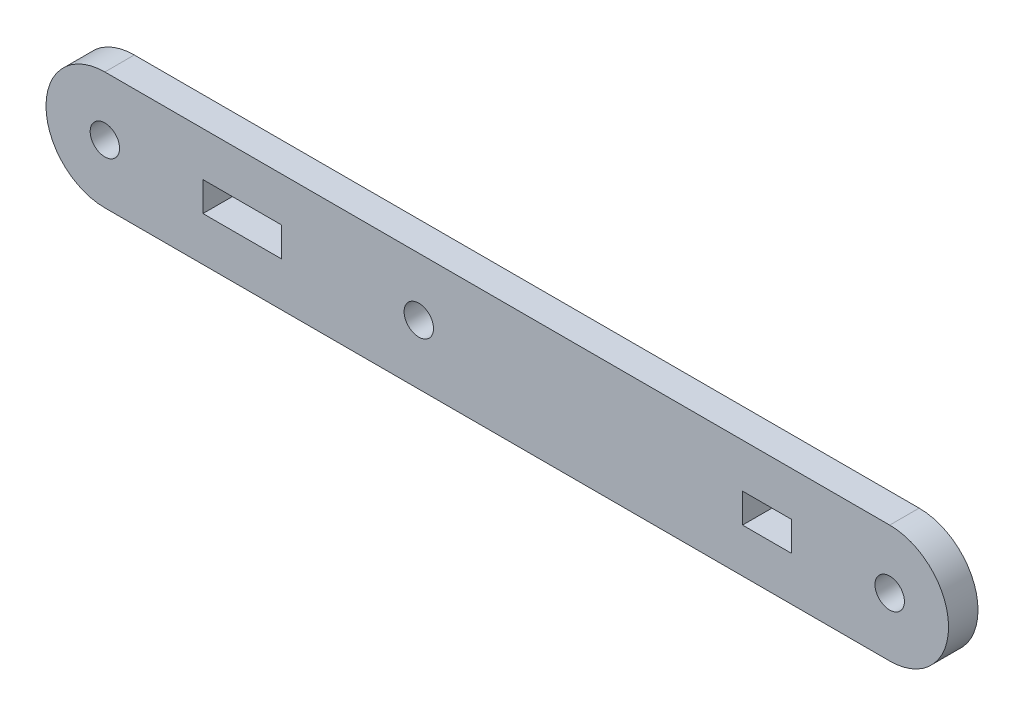
ISO-10303-21;
HEADER;
FILE_DESCRIPTION(('STEP AP214'),'2;1');
FILE_NAME('part.step','',(''),(''),'','','');
FILE_SCHEMA(('AUTOMOTIVE_DESIGN { 1 0 10303 214 1 1 1 1 }'));
ENDSEC;
DATA;
#1=APPLICATION_CONTEXT('core data for automotive mechanical design processes');
#2=APPLICATION_PROTOCOL_DEFINITION('international standard','automotive_design',2000,#1);
#3=PRODUCT_CONTEXT('',#1,'mechanical');
#4=PRODUCT('Part','Part','',(#3));
#5=PRODUCT_RELATED_PRODUCT_CATEGORY('part','',(#4));
#6=PRODUCT_DEFINITION_FORMATION('','',#4);
#7=PRODUCT_DEFINITION_CONTEXT('part definition',#1,'design');
#8=PRODUCT_DEFINITION('design','',#6,#7);
#9=PRODUCT_DEFINITION_SHAPE('','',#8);
#10=(LENGTH_UNIT() NAMED_UNIT(*) SI_UNIT(.MILLI.,.METRE.));
#11=(NAMED_UNIT(*) PLANE_ANGLE_UNIT() SI_UNIT($,.RADIAN.));
#12=(NAMED_UNIT(*) SI_UNIT($,.STERADIAN.) SOLID_ANGLE_UNIT());
#13=UNCERTAINTY_MEASURE_WITH_UNIT(LENGTH_MEASURE(1.E-05),#10,'distance_accuracy_value','');
#14=(GEOMETRIC_REPRESENTATION_CONTEXT(3) GLOBAL_UNCERTAINTY_ASSIGNED_CONTEXT((#13)) GLOBAL_UNIT_ASSIGNED_CONTEXT((#10,
#11,#12)) REPRESENTATION_CONTEXT('',''));
#15=CARTESIAN_POINT('',(0.,0.,0.));
#16=DIRECTION('',(0.,0.,1.));
#17=DIRECTION('',(1.,0.,0.));
#18=AXIS2_PLACEMENT_3D('',#15,#16,#17);
#19=CARTESIAN_POINT('',(-62.9738368541819,-40.5517486709935,3.));
#20=DIRECTION('',(0.,0.,1.));
#21=DIRECTION('',(1.,0.,0.));
#22=AXIS2_PLACEMENT_3D('',#19,#20,#21);
#23=PLANE('',#22);
#24=DIRECTION('',(1.,0.,0.));
#25=VECTOR('',#24,1.);
#26=CARTESIAN_POINT('',(-52.9738368541819,-42.0517486709935,3.));
#27=LINE('',#26,#25);
#28=CARTESIAN_POINT('',(-52.9738368541819,-42.0517486709935,3.));
#29=VERTEX_POINT('',#28);
#30=CARTESIAN_POINT('',(-44.9738368541819,-42.0517486709935,3.));
#31=VERTEX_POINT('',#30);
#32=EDGE_CURVE('E164',#29,#31,#27,.T.);
#33=ORIENTED_EDGE('',*,*,#32,.F.);
#34=DIRECTION('',(0.,-1.,0.));
#35=VECTOR('',#34,1.);
#36=CARTESIAN_POINT('',(-52.9738368541819,-42.0517486709935,3.));
#37=LINE('',#36,#35);
#38=CARTESIAN_POINT('',(-52.9738368541819,-39.0517486709935,3.));
#39=VERTEX_POINT('',#38);
#40=EDGE_CURVE('E162',#39,#29,#37,.T.);
#41=ORIENTED_EDGE('',*,*,#40,.F.);
#42=DIRECTION('',(-1.,0.,0.));
#43=VECTOR('',#42,1.);
#44=CARTESIAN_POINT('',(-52.9738368541819,-39.0517486709935,3.));
#45=LINE('',#44,#43);
#46=CARTESIAN_POINT('',(-44.9738368541819,-39.0517486709935,3.));
#47=VERTEX_POINT('',#46);
#48=EDGE_CURVE('E170',#47,#39,#45,.T.);
#49=ORIENTED_EDGE('',*,*,#48,.F.);
#50=DIRECTION('',(0.,1.,0.));
#51=VECTOR('',#50,1.);
#52=CARTESIAN_POINT('',(-44.9738368541819,-42.0517486709935,3.));
#53=LINE('',#52,#51);
#54=EDGE_CURVE('E167',#31,#47,#53,.T.);
#55=ORIENTED_EDGE('',*,*,#54,.F.);
#56=EDGE_LOOP('',(#33,#41,#49,#55));
#57=FACE_BOUND('',#56,.T.);
#58=CARTESIAN_POINT('',(-30.9738368541819,-40.4576031559384,3.));
#59=DIRECTION('',(0.,0.,1.));
#60=DIRECTION('',(1.,0.,0.));
#61=AXIS2_PLACEMENT_3D('',#58,#59,#60);
#62=CIRCLE('',#61,1.5);
#63=CARTESIAN_POINT('',(-29.4738368541819,-40.4576031559384,3.));
#64=VERTEX_POINT('',#63);
#65=EDGE_CURVE('E199',#64,#64,#62,.T.);
#66=ORIENTED_EDGE('',*,*,#65,.F.);
#67=EDGE_LOOP('',(#66));
#68=FACE_BOUND('',#67,.T.);
#69=CARTESIAN_POINT('',(-62.9738368541819,-40.5517486709935,3.));
#70=DIRECTION('',(0.,0.,1.));
#71=DIRECTION('',(1.,0.,0.));
#72=AXIS2_PLACEMENT_3D('',#69,#70,#71);
#73=CIRCLE('',#72,6.);
#74=CARTESIAN_POINT('',(-62.9738368541819,-34.5517486709935,3.));
#75=VERTEX_POINT('',#74);
#76=CARTESIAN_POINT('',(-62.9738368541819,-46.5517486709935,3.));
#77=VERTEX_POINT('',#76);
#78=EDGE_CURVE('E211',#75,#77,#73,.T.);
#79=ORIENTED_EDGE('',*,*,#78,.T.);
#80=DIRECTION('',(1.,0.,0.));
#81=VECTOR('',#80,1.);
#82=CARTESIAN_POINT('',(-62.9738368541819,-46.5517486709935,3.));
#83=LINE('',#82,#81);
#84=CARTESIAN_POINT('',(17.0261631458181,-46.5517486709935,3.));
#85=VERTEX_POINT('',#84);
#86=EDGE_CURVE('E214',#77,#85,#83,.T.);
#87=ORIENTED_EDGE('',*,*,#86,.T.);
#88=CARTESIAN_POINT('',(17.0261631458181,-40.5517486709935,3.));
#89=DIRECTION('',(0.,0.,1.));
#90=DIRECTION('',(1.,0.,0.));
#91=AXIS2_PLACEMENT_3D('',#88,#89,#90);
#92=CIRCLE('',#91,6.);
#93=CARTESIAN_POINT('',(17.0261631458181,-34.5517486709935,3.));
#94=VERTEX_POINT('',#93);
#95=EDGE_CURVE('E217',#85,#94,#92,.T.);
#96=ORIENTED_EDGE('',*,*,#95,.T.);
#97=DIRECTION('',(-1.,0.,0.));
#98=VECTOR('',#97,1.);
#99=CARTESIAN_POINT('',(-62.9738368541819,-34.5517486709935,3.));
#100=LINE('',#99,#98);
#101=EDGE_CURVE('E219',#94,#75,#100,.T.);
#102=ORIENTED_EDGE('',*,*,#101,.T.);
#103=EDGE_LOOP('',(#79,#87,#96,#102));
#104=FACE_BOUND('',#103,.T.);
#105=CARTESIAN_POINT('',(-62.9738368541819,-40.5517486709935,3.));
#106=DIRECTION('',(0.,0.,1.));
#107=DIRECTION('',(1.,0.,0.));
#108=AXIS2_PLACEMENT_3D('',#105,#106,#107);
#109=CIRCLE('',#108,1.5);
#110=CARTESIAN_POINT('',(-61.4738368541819,-40.5517486709935,3.));
#111=VERTEX_POINT('',#110);
#112=EDGE_CURVE('E205',#111,#111,#109,.T.);
#113=ORIENTED_EDGE('',*,*,#112,.F.);
#114=EDGE_LOOP('',(#113));
#115=FACE_BOUND('',#114,.T.);
#116=CARTESIAN_POINT('',(17.0261631458181,-40.5517486709935,3.));
#117=DIRECTION('',(0.,0.,1.));
#118=DIRECTION('',(1.,0.,0.));
#119=AXIS2_PLACEMENT_3D('',#116,#117,#118);
#120=CIRCLE('',#119,1.5);
#121=CARTESIAN_POINT('',(18.5261631458181,-40.5517486709935,3.));
#122=VERTEX_POINT('',#121);
#123=EDGE_CURVE('E193',#122,#122,#120,.T.);
#124=ORIENTED_EDGE('',*,*,#123,.F.);
#125=EDGE_LOOP('',(#124));
#126=FACE_BOUND('',#125,.T.);
#127=DIRECTION('',(1.,0.,0.));
#128=VECTOR('',#127,1.);
#129=CARTESIAN_POINT('',(2.0261631458181,-42.0517486709935,3.));
#130=LINE('',#129,#128);
#131=CARTESIAN_POINT('',(2.0261631458181,-42.0517486709935,3.));
#132=VERTEX_POINT('',#131);
#133=CARTESIAN_POINT('',(7.0261631458181,-42.0517486709935,3.));
#134=VERTEX_POINT('',#133);
#135=EDGE_CURVE('E134',#132,#134,#130,.T.);
#136=ORIENTED_EDGE('',*,*,#135,.F.);
#137=DIRECTION('',(0.,-1.,0.));
#138=VECTOR('',#137,1.);
#139=CARTESIAN_POINT('',(2.0261631458181,-42.0517486709935,3.));
#140=LINE('',#139,#138);
#141=CARTESIAN_POINT('',(2.0261631458181,-39.0517486709935,3.));
#142=VERTEX_POINT('',#141);
#143=EDGE_CURVE('E126',#142,#132,#140,.T.);
#144=ORIENTED_EDGE('',*,*,#143,.F.);
#145=DIRECTION('',(-1.,0.,0.));
#146=VECTOR('',#145,1.);
#147=CARTESIAN_POINT('',(2.0261631458181,-39.0517486709935,3.));
#148=LINE('',#147,#146);
#149=CARTESIAN_POINT('',(7.0261631458181,-39.0517486709935,3.));
#150=VERTEX_POINT('',#149);
#151=EDGE_CURVE('E148',#150,#142,#148,.T.);
#152=ORIENTED_EDGE('',*,*,#151,.F.);
#153=DIRECTION('',(0.,1.,0.));
#154=VECTOR('',#153,1.);
#155=CARTESIAN_POINT('',(7.0261631458181,-42.0517486709935,3.));
#156=LINE('',#155,#154);
#157=EDGE_CURVE('E146',#134,#150,#156,.T.);
#158=ORIENTED_EDGE('',*,*,#157,.F.);
#159=EDGE_LOOP('',(#136,#144,#152,#158));
#160=FACE_BOUND('',#159,.T.);
#161=ADVANCED_FACE('F37',(#57,#68,#104,#115,#126,#160),#23,.T.);
#162=CARTESIAN_POINT('',(-62.9738368541819,-40.5517486709935,0.));
#163=DIRECTION('',(0.,0.,1.));
#164=DIRECTION('',(1.,0.,0.));
#165=AXIS2_PLACEMENT_3D('',#162,#163,#164);
#166=PLANE('',#165);
#167=DIRECTION('',(0.,-1.,0.));
#168=VECTOR('',#167,1.);
#169=CARTESIAN_POINT('',(-52.9738368541819,-42.0517486709935,0.));
#170=LINE('',#169,#168);
#171=CARTESIAN_POINT('',(-52.9738368541819,-39.0517486709935,0.));
#172=VERTEX_POINT('',#171);
#173=CARTESIAN_POINT('',(-52.9738368541819,-42.0517486709935,0.));
#174=VERTEX_POINT('',#173);
#175=EDGE_CURVE('E142',#172,#174,#170,.T.);
#176=ORIENTED_EDGE('',*,*,#175,.T.);
#177=DIRECTION('',(1.,0.,0.));
#178=VECTOR('',#177,1.);
#179=CARTESIAN_POINT('',(-52.9738368541819,-42.0517486709935,0.));
#180=LINE('',#179,#178);
#181=CARTESIAN_POINT('',(-44.9738368541819,-42.0517486709935,0.));
#182=VERTEX_POINT('',#181);
#183=EDGE_CURVE('E175',#174,#182,#180,.T.);
#184=ORIENTED_EDGE('',*,*,#183,.T.);
#185=DIRECTION('',(0.,1.,0.));
#186=VECTOR('',#185,1.);
#187=CARTESIAN_POINT('',(-44.9738368541819,-42.0517486709935,0.));
#188=LINE('',#187,#186);
#189=CARTESIAN_POINT('',(-44.9738368541819,-39.0517486709935,0.));
#190=VERTEX_POINT('',#189);
#191=EDGE_CURVE('E178',#182,#190,#188,.T.);
#192=ORIENTED_EDGE('',*,*,#191,.T.);
#193=DIRECTION('',(-1.,0.,0.));
#194=VECTOR('',#193,1.);
#195=CARTESIAN_POINT('',(-52.9738368541819,-39.0517486709935,0.));
#196=LINE('',#195,#194);
#197=EDGE_CURVE('E165',#190,#172,#196,.T.);
#198=ORIENTED_EDGE('',*,*,#197,.T.);
#199=EDGE_LOOP('',(#176,#184,#192,#198));
#200=FACE_BOUND('',#199,.T.);
#201=CARTESIAN_POINT('',(-30.9738368541819,-40.4576031559384,0.));
#202=DIRECTION('',(0.,0.,1.));
#203=DIRECTION('',(1.,0.,0.));
#204=AXIS2_PLACEMENT_3D('',#201,#202,#203);
#205=CIRCLE('',#204,1.5);
#206=CARTESIAN_POINT('',(-29.4738368541819,-40.4576031559384,0.));
#207=VERTEX_POINT('',#206);
#208=EDGE_CURVE('E196',#207,#207,#205,.T.);
#209=ORIENTED_EDGE('',*,*,#208,.T.);
#210=EDGE_LOOP('',(#209));
#211=FACE_BOUND('',#210,.T.);
#212=CARTESIAN_POINT('',(-62.9738368541819,-40.5517486709935,0.));
#213=DIRECTION('',(0.,0.,1.));
#214=DIRECTION('',(1.,0.,0.));
#215=AXIS2_PLACEMENT_3D('',#212,#213,#214);
#216=CIRCLE('',#215,6.);
#217=CARTESIAN_POINT('',(-62.9738368541819,-34.5517486709935,0.));
#218=VERTEX_POINT('',#217);
#219=CARTESIAN_POINT('',(-62.9738368541819,-46.5517486709935,0.));
#220=VERTEX_POINT('',#219);
#221=EDGE_CURVE('E208',#218,#220,#216,.T.);
#222=ORIENTED_EDGE('',*,*,#221,.F.);
#223=DIRECTION('',(-1.,0.,0.));
#224=VECTOR('',#223,1.);
#225=CARTESIAN_POINT('',(-62.9738368541819,-34.5517486709935,0.));
#226=LINE('',#225,#224);
#227=CARTESIAN_POINT('',(17.0261631458181,-34.5517486709935,0.));
#228=VERTEX_POINT('',#227);
#229=EDGE_CURVE('E215',#228,#218,#226,.T.);
#230=ORIENTED_EDGE('',*,*,#229,.F.);
#231=CARTESIAN_POINT('',(17.0261631458181,-40.5517486709935,0.));
#232=DIRECTION('',(0.,0.,1.));
#233=DIRECTION('',(1.,0.,0.));
#234=AXIS2_PLACEMENT_3D('',#231,#232,#233);
#235=CIRCLE('',#234,6.);
#236=CARTESIAN_POINT('',(17.0261631458181,-46.5517486709935,0.));
#237=VERTEX_POINT('',#236);
#238=EDGE_CURVE('E226',#237,#228,#235,.T.);
#239=ORIENTED_EDGE('',*,*,#238,.F.);
#240=DIRECTION('',(1.,0.,0.));
#241=VECTOR('',#240,1.);
#242=CARTESIAN_POINT('',(-62.9738368541819,-46.5517486709935,0.));
#243=LINE('',#242,#241);
#244=EDGE_CURVE('E224',#220,#237,#243,.T.);
#245=ORIENTED_EDGE('',*,*,#244,.F.);
#246=EDGE_LOOP('',(#222,#230,#239,#245));
#247=FACE_BOUND('',#246,.T.);
#248=CARTESIAN_POINT('',(-62.9738368541819,-40.5517486709935,0.));
#249=DIRECTION('',(0.,0.,1.));
#250=DIRECTION('',(1.,0.,0.));
#251=AXIS2_PLACEMENT_3D('',#248,#249,#250);
#252=CIRCLE('',#251,1.5);
#253=CARTESIAN_POINT('',(-61.4738368541819,-40.5517486709935,0.));
#254=VERTEX_POINT('',#253);
#255=EDGE_CURVE('E202',#254,#254,#252,.T.);
#256=ORIENTED_EDGE('',*,*,#255,.T.);
#257=EDGE_LOOP('',(#256));
#258=FACE_BOUND('',#257,.T.);
#259=CARTESIAN_POINT('',(17.0261631458181,-40.5517486709935,0.));
#260=DIRECTION('',(0.,0.,1.));
#261=DIRECTION('',(1.,0.,0.));
#262=AXIS2_PLACEMENT_3D('',#259,#260,#261);
#263=CIRCLE('',#262,1.5);
#264=CARTESIAN_POINT('',(18.5261631458181,-40.5517486709935,0.));
#265=VERTEX_POINT('',#264);
#266=EDGE_CURVE('E192',#265,#265,#263,.T.);
#267=ORIENTED_EDGE('',*,*,#266,.T.);
#268=EDGE_LOOP('',(#267));
#269=FACE_BOUND('',#268,.T.);
#270=DIRECTION('',(0.,-1.,0.));
#271=VECTOR('',#270,1.);
#272=CARTESIAN_POINT('',(2.0261631458181,-42.0517486709935,0.));
#273=LINE('',#272,#271);
#274=CARTESIAN_POINT('',(2.02616314581811,-39.0517486709935,0.));
#275=VERTEX_POINT('',#274);
#276=CARTESIAN_POINT('',(2.0261631458181,-42.0517486709935,0.));
#277=VERTEX_POINT('',#276);
#278=EDGE_CURVE('E60',#275,#277,#273,.T.);
#279=ORIENTED_EDGE('',*,*,#278,.T.);
#280=DIRECTION('',(1.,0.,0.));
#281=VECTOR('',#280,1.);
#282=CARTESIAN_POINT('',(2.0261631458181,-42.0517486709935,0.));
#283=LINE('',#282,#281);
#284=CARTESIAN_POINT('',(7.0261631458181,-42.0517486709935,0.));
#285=VERTEX_POINT('',#284);
#286=EDGE_CURVE('E141',#277,#285,#283,.T.);
#287=ORIENTED_EDGE('',*,*,#286,.T.);
#288=DIRECTION('',(0.,1.,0.));
#289=VECTOR('',#288,1.);
#290=CARTESIAN_POINT('',(7.0261631458181,-42.0517486709935,0.));
#291=LINE('',#290,#289);
#292=CARTESIAN_POINT('',(7.0261631458181,-39.0517486709935,0.));
#293=VERTEX_POINT('',#292);
#294=EDGE_CURVE('E154',#285,#293,#291,.T.);
#295=ORIENTED_EDGE('',*,*,#294,.T.);
#296=DIRECTION('',(-1.,0.,0.));
#297=VECTOR('',#296,1.);
#298=CARTESIAN_POINT('',(2.0261631458181,-39.0517486709935,0.));
#299=LINE('',#298,#297);
#300=EDGE_CURVE('E135',#293,#275,#299,.T.);
#301=ORIENTED_EDGE('',*,*,#300,.T.);
#302=EDGE_LOOP('',(#279,#287,#295,#301));
#303=FACE_BOUND('',#302,.T.);
#304=ADVANCED_FACE('F244',(#200,#211,#247,#258,#269,#303),#166,.F.);
#305=CARTESIAN_POINT('',(-62.9738368541819,-40.5517486709935,3.));
#306=DIRECTION('',(0.,0.,-1.));
#307=DIRECTION('',(-1.,0.,0.));
#308=AXIS2_PLACEMENT_3D('',#305,#306,#307);
#309=CYLINDRICAL_SURFACE('',#308,6.);
#310=ORIENTED_EDGE('',*,*,#221,.T.);
#311=DIRECTION('',(0.,0.,-1.));
#312=VECTOR('',#311,1.);
#313=CARTESIAN_POINT('',(-62.9738368541819,-46.5517486709935,3.));
#314=LINE('',#313,#312);
#315=EDGE_CURVE('E11',#77,#220,#314,.T.);
#316=ORIENTED_EDGE('',*,*,#315,.F.);
#317=ORIENTED_EDGE('',*,*,#78,.F.);
#318=DIRECTION('',(0.,0.,-1.));
#319=VECTOR('',#318,1.);
#320=CARTESIAN_POINT('',(-62.9738368541819,-34.5517486709935,3.));
#321=LINE('',#320,#319);
#322=EDGE_CURVE('E221',#75,#218,#321,.T.);
#323=ORIENTED_EDGE('',*,*,#322,.T.);
#324=EDGE_LOOP('',(#310,#316,#317,#323));
#325=FACE_BOUND('',#324,.T.);
#326=ADVANCED_FACE('F39',(#325),#309,.T.);
#327=CARTESIAN_POINT('',(-62.9738368541819,-46.5517486709935,3.));
#328=DIRECTION('',(0.,1.,0.));
#329=DIRECTION('',(0.,0.,1.));
#330=AXIS2_PLACEMENT_3D('',#327,#328,#329);
#331=PLANE('',#330);
#332=ORIENTED_EDGE('',*,*,#244,.T.);
#333=DIRECTION('',(0.,0.,-1.));
#334=VECTOR('',#333,1.);
#335=CARTESIAN_POINT('',(17.0261631458181,-46.5517486709935,3.));
#336=LINE('',#335,#334);
#337=EDGE_CURVE('E45',#85,#237,#336,.T.);
#338=ORIENTED_EDGE('',*,*,#337,.F.);
#339=ORIENTED_EDGE('',*,*,#86,.F.);
#340=ORIENTED_EDGE('',*,*,#315,.T.);
#341=EDGE_LOOP('',(#332,#338,#339,#340));
#342=FACE_BOUND('',#341,.T.);
#343=ADVANCED_FACE('F255',(#342),#331,.F.);
#344=CARTESIAN_POINT('',(17.0261631458181,-40.5517486709935,3.));
#345=DIRECTION('',(0.,0.,-1.));
#346=DIRECTION('',(-1.,0.,0.));
#347=AXIS2_PLACEMENT_3D('',#344,#345,#346);
#348=CYLINDRICAL_SURFACE('',#347,6.);
#349=ORIENTED_EDGE('',*,*,#238,.T.);
#350=DIRECTION('',(0.,0.,-1.));
#351=VECTOR('',#350,1.);
#352=CARTESIAN_POINT('',(17.0261631458181,-34.5517486709935,3.));
#353=LINE('',#352,#351);
#354=EDGE_CURVE('E231',#94,#228,#353,.T.);
#355=ORIENTED_EDGE('',*,*,#354,.F.);
#356=ORIENTED_EDGE('',*,*,#95,.F.);
#357=ORIENTED_EDGE('',*,*,#337,.T.);
#358=EDGE_LOOP('',(#349,#355,#356,#357));
#359=FACE_BOUND('',#358,.T.);
#360=ADVANCED_FACE('F238',(#359),#348,.T.);
#361=CARTESIAN_POINT('',(-62.9738368541819,-34.5517486709935,3.));
#362=DIRECTION('',(0.,-1.,0.));
#363=DIRECTION('',(0.,0.,-1.));
#364=AXIS2_PLACEMENT_3D('',#361,#362,#363);
#365=PLANE('',#364);
#366=ORIENTED_EDGE('',*,*,#229,.T.);
#367=ORIENTED_EDGE('',*,*,#322,.F.);
#368=ORIENTED_EDGE('',*,*,#101,.F.);
#369=ORIENTED_EDGE('',*,*,#354,.T.);
#370=EDGE_LOOP('',(#366,#367,#368,#369));
#371=FACE_BOUND('',#370,.T.);
#372=ADVANCED_FACE('F248',(#371),#365,.F.);
#373=CARTESIAN_POINT('',(-62.9738368541819,-40.5517486709935,3.));
#374=DIRECTION('',(0.,0.,-1.));
#375=DIRECTION('',(-1.,0.,0.));
#376=AXIS2_PLACEMENT_3D('',#373,#374,#375);
#377=CYLINDRICAL_SURFACE('',#376,1.5);
#378=ORIENTED_EDGE('',*,*,#112,.T.);
#379=EDGE_LOOP('',(#378));
#380=FACE_BOUND('',#379,.T.);
#381=ORIENTED_EDGE('',*,*,#255,.F.);
#382=EDGE_LOOP('',(#381));
#383=FACE_BOUND('',#382,.T.);
#384=ADVANCED_FACE('F273',(#380,#383),#377,.F.);
#385=CARTESIAN_POINT('',(-30.9738368541819,-40.4576031559384,3.));
#386=DIRECTION('',(0.,0.,-1.));
#387=DIRECTION('',(-1.,0.,0.));
#388=AXIS2_PLACEMENT_3D('',#385,#386,#387);
#389=CYLINDRICAL_SURFACE('',#388,1.5);
#390=ORIENTED_EDGE('',*,*,#65,.T.);
#391=EDGE_LOOP('',(#390));
#392=FACE_BOUND('',#391,.T.);
#393=ORIENTED_EDGE('',*,*,#208,.F.);
#394=EDGE_LOOP('',(#393));
#395=FACE_BOUND('',#394,.T.);
#396=ADVANCED_FACE('F280',(#392,#395),#389,.F.);
#397=CARTESIAN_POINT('',(17.0261631458181,-40.5517486709935,3.));
#398=DIRECTION('',(0.,0.,-1.));
#399=DIRECTION('',(-1.,0.,0.));
#400=AXIS2_PLACEMENT_3D('',#397,#398,#399);
#401=CYLINDRICAL_SURFACE('',#400,1.5);
#402=ORIENTED_EDGE('',*,*,#123,.T.);
#403=EDGE_LOOP('',(#402));
#404=FACE_BOUND('',#403,.T.);
#405=ORIENTED_EDGE('',*,*,#266,.F.);
#406=EDGE_LOOP('',(#405));
#407=FACE_BOUND('',#406,.T.);
#408=ADVANCED_FACE('F285',(#404,#407),#401,.F.);
#409=CARTESIAN_POINT('',(-52.9738368541819,-42.0517486709935,3.));
#410=DIRECTION('',(1.,0.,0.));
#411=DIRECTION('',(0.,0.,-1.));
#412=AXIS2_PLACEMENT_3D('',#409,#410,#411);
#413=PLANE('',#412);
#414=ORIENTED_EDGE('',*,*,#175,.F.);
#415=DIRECTION('',(0.,0.,-1.));
#416=VECTOR('',#415,1.);
#417=CARTESIAN_POINT('',(-52.9738368541819,-39.0517486709935,3.));
#418=LINE('',#417,#416);
#419=EDGE_CURVE('E172',#39,#172,#418,.T.);
#420=ORIENTED_EDGE('',*,*,#419,.F.);
#421=ORIENTED_EDGE('',*,*,#40,.T.);
#422=DIRECTION('',(0.,0.,-1.));
#423=VECTOR('',#422,1.);
#424=CARTESIAN_POINT('',(-52.9738368541819,-42.0517486709935,3.));
#425=LINE('',#424,#423);
#426=EDGE_CURVE('E189',#29,#174,#425,.T.);
#427=ORIENTED_EDGE('',*,*,#426,.T.);
#428=EDGE_LOOP('',(#414,#420,#421,#427));
#429=FACE_BOUND('',#428,.T.);
#430=ADVANCED_FACE('F319',(#429),#413,.T.);
#431=CARTESIAN_POINT('',(-52.9738368541819,-42.0517486709935,3.));
#432=DIRECTION('',(0.,1.,0.));
#433=DIRECTION('',(0.,0.,1.));
#434=AXIS2_PLACEMENT_3D('',#431,#432,#433);
#435=PLANE('',#434);
#436=ORIENTED_EDGE('',*,*,#183,.F.);
#437=ORIENTED_EDGE('',*,*,#426,.F.);
#438=ORIENTED_EDGE('',*,*,#32,.T.);
#439=DIRECTION('',(0.,0.,-1.));
#440=VECTOR('',#439,1.);
#441=CARTESIAN_POINT('',(-44.9738368541819,-42.0517486709935,3.));
#442=LINE('',#441,#440);
#443=EDGE_CURVE('E187',#31,#182,#442,.T.);
#444=ORIENTED_EDGE('',*,*,#443,.T.);
#445=EDGE_LOOP('',(#436,#437,#438,#444));
#446=FACE_BOUND('',#445,.T.);
#447=ADVANCED_FACE('F315',(#446),#435,.T.);
#448=CARTESIAN_POINT('',(-44.9738368541819,-42.0517486709935,3.));
#449=DIRECTION('',(-1.,0.,0.));
#450=DIRECTION('',(0.,0.,1.));
#451=AXIS2_PLACEMENT_3D('',#448,#449,#450);
#452=PLANE('',#451);
#453=ORIENTED_EDGE('',*,*,#191,.F.);
#454=ORIENTED_EDGE('',*,*,#443,.F.);
#455=ORIENTED_EDGE('',*,*,#54,.T.);
#456=DIRECTION('',(0.,0.,-1.));
#457=VECTOR('',#456,1.);
#458=CARTESIAN_POINT('',(-44.9738368541819,-39.0517486709935,3.));
#459=LINE('',#458,#457);
#460=EDGE_CURVE('E185',#47,#190,#459,.T.);
#461=ORIENTED_EDGE('',*,*,#460,.T.);
#462=EDGE_LOOP('',(#453,#454,#455,#461));
#463=FACE_BOUND('',#462,.T.);
#464=ADVANCED_FACE('F311',(#463),#452,.T.);
#465=CARTESIAN_POINT('',(-52.9738368541819,-39.0517486709935,3.));
#466=DIRECTION('',(0.,-1.,0.));
#467=DIRECTION('',(0.,0.,-1.));
#468=AXIS2_PLACEMENT_3D('',#465,#466,#467);
#469=PLANE('',#468);
#470=ORIENTED_EDGE('',*,*,#197,.F.);
#471=ORIENTED_EDGE('',*,*,#460,.F.);
#472=ORIENTED_EDGE('',*,*,#48,.T.);
#473=ORIENTED_EDGE('',*,*,#419,.T.);
#474=EDGE_LOOP('',(#470,#471,#472,#473));
#475=FACE_BOUND('',#474,.T.);
#476=ADVANCED_FACE('F308',(#475),#469,.T.);
#477=CARTESIAN_POINT('',(2.0261631458181,-42.0517486709935,3.));
#478=DIRECTION('',(1.,0.,0.));
#479=DIRECTION('',(0.,0.,-1.));
#480=AXIS2_PLACEMENT_3D('',#477,#478,#479);
#481=PLANE('',#480);
#482=ORIENTED_EDGE('',*,*,#278,.F.);
#483=DIRECTION('',(0.,0.,-1.));
#484=VECTOR('',#483,1.);
#485=CARTESIAN_POINT('',(2.0261631458181,-39.0517486709935,3.));
#486=LINE('',#485,#484);
#487=EDGE_CURVE('E130',#142,#275,#486,.T.);
#488=ORIENTED_EDGE('',*,*,#487,.F.);
#489=ORIENTED_EDGE('',*,*,#143,.T.);
#490=DIRECTION('',(0.,0.,-1.));
#491=VECTOR('',#490,1.);
#492=CARTESIAN_POINT('',(2.0261631458181,-42.0517486709935,3.));
#493=LINE('',#492,#491);
#494=EDGE_CURVE('E129',#132,#277,#493,.T.);
#495=ORIENTED_EDGE('',*,*,#494,.T.);
#496=EDGE_LOOP('',(#482,#488,#489,#495));
#497=FACE_BOUND('',#496,.T.);
#498=ADVANCED_FACE('F128',(#497),#481,.T.);
#499=CARTESIAN_POINT('',(2.0261631458181,-42.0517486709935,3.));
#500=DIRECTION('',(0.,1.,0.));
#501=DIRECTION('',(0.,0.,1.));
#502=AXIS2_PLACEMENT_3D('',#499,#500,#501);
#503=PLANE('',#502);
#504=ORIENTED_EDGE('',*,*,#286,.F.);
#505=ORIENTED_EDGE('',*,*,#494,.F.);
#506=ORIENTED_EDGE('',*,*,#135,.T.);
#507=DIRECTION('',(0.,0.,-1.));
#508=VECTOR('',#507,1.);
#509=CARTESIAN_POINT('',(7.0261631458181,-42.0517486709935,3.));
#510=LINE('',#509,#508);
#511=EDGE_CURVE('E143',#134,#285,#510,.T.);
#512=ORIENTED_EDGE('',*,*,#511,.T.);
#513=EDGE_LOOP('',(#504,#505,#506,#512));
#514=FACE_BOUND('',#513,.T.);
#515=ADVANCED_FACE('F138',(#514),#503,.T.);
#516=CARTESIAN_POINT('',(7.0261631458181,-42.0517486709935,3.));
#517=DIRECTION('',(-1.,0.,0.));
#518=DIRECTION('',(0.,0.,1.));
#519=AXIS2_PLACEMENT_3D('',#516,#517,#518);
#520=PLANE('',#519);
#521=ORIENTED_EDGE('',*,*,#294,.F.);
#522=ORIENTED_EDGE('',*,*,#511,.F.);
#523=ORIENTED_EDGE('',*,*,#157,.T.);
#524=DIRECTION('',(0.,0.,-1.));
#525=VECTOR('',#524,1.);
#526=CARTESIAN_POINT('',(7.0261631458181,-39.0517486709935,3.));
#527=LINE('',#526,#525);
#528=EDGE_CURVE('E52',#150,#293,#527,.T.);
#529=ORIENTED_EDGE('',*,*,#528,.T.);
#530=EDGE_LOOP('',(#521,#522,#523,#529));
#531=FACE_BOUND('',#530,.T.);
#532=ADVANCED_FACE('F296',(#531),#520,.T.);
#533=CARTESIAN_POINT('',(2.0261631458181,-39.0517486709935,3.));
#534=DIRECTION('',(0.,-1.,0.));
#535=DIRECTION('',(0.,0.,-1.));
#536=AXIS2_PLACEMENT_3D('',#533,#534,#535);
#537=PLANE('',#536);
#538=ORIENTED_EDGE('',*,*,#300,.F.);
#539=ORIENTED_EDGE('',*,*,#528,.F.);
#540=ORIENTED_EDGE('',*,*,#151,.T.);
#541=ORIENTED_EDGE('',*,*,#487,.T.);
#542=EDGE_LOOP('',(#538,#539,#540,#541));
#543=FACE_BOUND('',#542,.T.);
#544=ADVANCED_FACE('F294',(#543),#537,.T.);
#545=CLOSED_SHELL('',(#161,#304,#326,#343,#360,#372,#384,#396,#408,#430,#447,#464,#476,#498,
#515,#532,#544));
#546=MANIFOLD_SOLID_BREP('B2',#545);
#547=ADVANCED_BREP_SHAPE_REPRESENTATION('',(#18,#546),#14);
#548=SHAPE_DEFINITION_REPRESENTATION(#9,#547);
ENDSEC;
END-ISO-10303-21;
